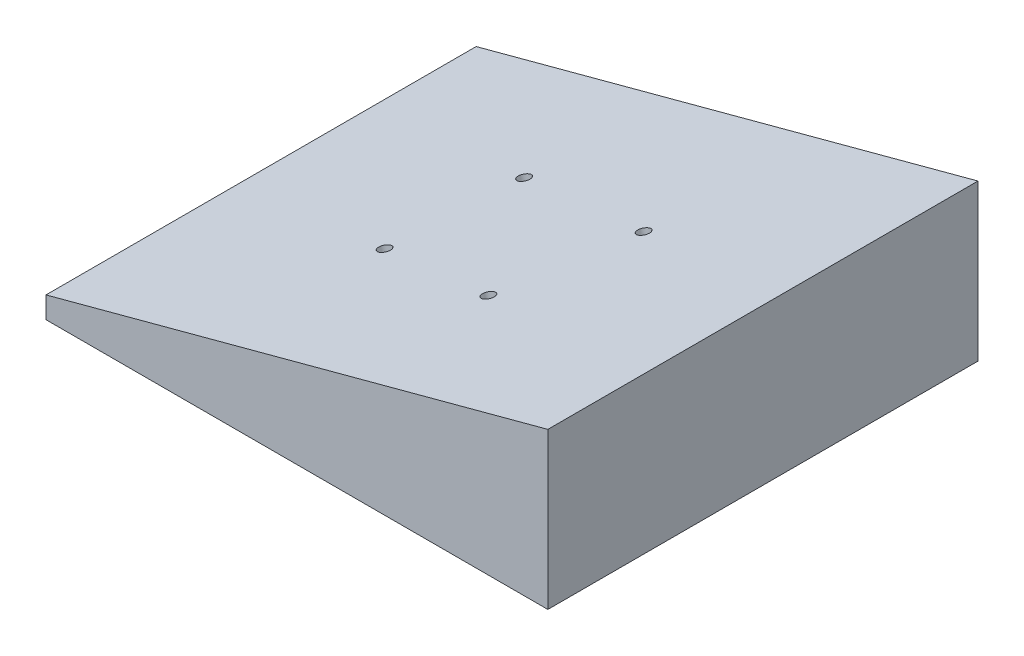
ISO-10303-21;
HEADER;
FILE_DESCRIPTION(('STEP AP214'),'2;1');
FILE_NAME('part.step','',(''),(''),'','','');
FILE_SCHEMA(('AUTOMOTIVE_DESIGN { 1 0 10303 214 1 1 1 1 }'));
ENDSEC;
DATA;
#1=APPLICATION_CONTEXT('core data for automotive mechanical design processes');
#2=APPLICATION_PROTOCOL_DEFINITION('international standard','automotive_design',2000,#1);
#3=PRODUCT_CONTEXT('',#1,'mechanical');
#4=PRODUCT('Part','Part','',(#3));
#5=PRODUCT_RELATED_PRODUCT_CATEGORY('part','',(#4));
#6=PRODUCT_DEFINITION_FORMATION('','',#4);
#7=PRODUCT_DEFINITION_CONTEXT('part definition',#1,'design');
#8=PRODUCT_DEFINITION('design','',#6,#7);
#9=PRODUCT_DEFINITION_SHAPE('','',#8);
#10=(LENGTH_UNIT() NAMED_UNIT(*) SI_UNIT(.MILLI.,.METRE.));
#11=(NAMED_UNIT(*) PLANE_ANGLE_UNIT() SI_UNIT($,.RADIAN.));
#12=(NAMED_UNIT(*) SI_UNIT($,.STERADIAN.) SOLID_ANGLE_UNIT());
#13=UNCERTAINTY_MEASURE_WITH_UNIT(LENGTH_MEASURE(1.E-05),#10,'distance_accuracy_value','');
#14=(GEOMETRIC_REPRESENTATION_CONTEXT(3) GLOBAL_UNCERTAINTY_ASSIGNED_CONTEXT((#13)) GLOBAL_UNIT_ASSIGNED_CONTEXT((#10,
#11,#12)) REPRESENTATION_CONTEXT('',''));
#15=CARTESIAN_POINT('',(0.,0.,0.));
#16=DIRECTION('',(0.,0.,1.));
#17=DIRECTION('',(1.,0.,0.));
#18=AXIS2_PLACEMENT_3D('',#15,#16,#17);
#19=CARTESIAN_POINT('',(0.,3.,60.));
#20=DIRECTION('',(1.,0.,0.));
#21=DIRECTION('',(0.,0.,-1.));
#22=AXIS2_PLACEMENT_3D('',#19,#20,#21);
#23=PLANE('',#22);
#24=DIRECTION('',(0.,-1.,0.));
#25=VECTOR('',#24,1.);
#26=CARTESIAN_POINT('',(0.,3.,0.));
#27=LINE('',#26,#25);
#28=CARTESIAN_POINT('',(0.,3.,0.));
#29=VERTEX_POINT('',#28);
#30=CARTESIAN_POINT('',(0.,0.,0.));
#31=VERTEX_POINT('',#30);
#32=EDGE_CURVE('E107',#29,#31,#27,.T.);
#33=ORIENTED_EDGE('',*,*,#32,.T.);
#34=DIRECTION('',(0.,0.,-1.));
#35=VECTOR('',#34,1.);
#36=CARTESIAN_POINT('',(0.,0.,60.));
#37=LINE('',#36,#35);
#38=CARTESIAN_POINT('',(0.,0.,60.));
#39=VERTEX_POINT('',#38);
#40=EDGE_CURVE('E11',#39,#31,#37,.T.);
#41=ORIENTED_EDGE('',*,*,#40,.F.);
#42=DIRECTION('',(0.,-1.,0.));
#43=VECTOR('',#42,1.);
#44=CARTESIAN_POINT('',(0.,3.,60.));
#45=LINE('',#44,#43);
#46=CARTESIAN_POINT('',(0.,3.,60.));
#47=VERTEX_POINT('',#46);
#48=EDGE_CURVE('E94',#47,#39,#45,.T.);
#49=ORIENTED_EDGE('',*,*,#48,.F.);
#50=DIRECTION('',(0.,0.,-1.));
#51=VECTOR('',#50,1.);
#52=CARTESIAN_POINT('',(0.,3.,60.));
#53=LINE('',#52,#51);
#54=EDGE_CURVE('E103',#47,#29,#53,.T.);
#55=ORIENTED_EDGE('',*,*,#54,.T.);
#56=EDGE_LOOP('',(#33,#41,#49,#55));
#57=FACE_BOUND('',#56,.T.);
#58=ADVANCED_FACE('F41',(#57),#23,.F.);
#59=CARTESIAN_POINT('',(0.,0.,60.));
#60=DIRECTION('',(0.,1.,0.));
#61=DIRECTION('',(0.,0.,1.));
#62=AXIS2_PLACEMENT_3D('',#59,#60,#61);
#63=PLANE('',#62);
#64=CARTESIAN_POINT('',(28.8739804761302,0.,19.503));
#65=DIRECTION('',(0.,1.,0.));
#66=DIRECTION('',(-1.,0.,0.));
#67=AXIS2_PLACEMENT_3D('',#64,#65,#66);
#68=ELLIPSE('',#67,0.879984753348569,0.849999999999999);
#69=CARTESIAN_POINT('',(27.9939957227816,0.,19.503));
#70=VERTEX_POINT('',#69);
#71=EDGE_CURVE('E110',#70,#70,#68,.T.);
#72=ORIENTED_EDGE('',*,*,#71,.T.);
#73=EDGE_LOOP('',(#72));
#74=FACE_BOUND('',#73,.T.);
#75=CARTESIAN_POINT('',(50.6230624741852,0.,23.123));
#76=DIRECTION('',(0.,1.,0.));
#77=DIRECTION('',(-1.,0.,0.));
#78=AXIS2_PLACEMENT_3D('',#75,#76,#77);
#79=ELLIPSE('',#78,0.87998475334857,0.849999999999999);
#80=CARTESIAN_POINT('',(49.7430777208366,0.,23.123));
#81=VERTEX_POINT('',#80);
#82=EDGE_CURVE('E125',#81,#81,#79,.T.);
#83=ORIENTED_EDGE('',*,*,#82,.T.);
#84=EDGE_LOOP('',(#83));
#85=FACE_BOUND('',#84,.T.);
#86=CARTESIAN_POINT('',(46.0398948235098,0.,40.502));
#87=DIRECTION('',(0.,1.,0.));
#88=DIRECTION('',(-1.,0.,0.));
#89=AXIS2_PLACEMENT_3D('',#86,#87,#88);
#90=ELLIPSE('',#89,0.879984753348569,0.849999999999998);
#91=CARTESIAN_POINT('',(45.1599100701612,0.,40.502));
#92=VERTEX_POINT('',#91);
#93=EDGE_CURVE('E122',#92,#92,#90,.T.);
#94=ORIENTED_EDGE('',*,*,#93,.T.);
#95=EDGE_LOOP('',(#94));
#96=FACE_BOUND('',#95,.T.);
#97=CARTESIAN_POINT('',(27.1968330638658,0.,37.391));
#98=DIRECTION('',(0.,1.,0.));
#99=DIRECTION('',(-1.,0.,0.));
#100=AXIS2_PLACEMENT_3D('',#97,#98,#99);
#101=ELLIPSE('',#100,0.87998475334857,0.85);
#102=CARTESIAN_POINT('',(26.3168483105173,0.,37.391));
#103=VERTEX_POINT('',#102);
#104=EDGE_CURVE('E119',#103,#103,#101,.T.);
#105=ORIENTED_EDGE('',*,*,#104,.T.);
#106=EDGE_LOOP('',(#105));
#107=FACE_BOUND('',#106,.T.);
#108=DIRECTION('',(1.,0.,0.));
#109=VECTOR('',#108,1.);
#110=CARTESIAN_POINT('',(0.,0.,0.));
#111=LINE('',#110,#109);
#112=CARTESIAN_POINT('',(70.,0.,0.));
#113=VERTEX_POINT('',#112);
#114=EDGE_CURVE('E98',#31,#113,#111,.T.);
#115=ORIENTED_EDGE('',*,*,#114,.T.);
#116=DIRECTION('',(0.,0.,-1.));
#117=VECTOR('',#116,1.);
#118=CARTESIAN_POINT('',(70.,0.,60.));
#119=LINE('',#118,#117);
#120=CARTESIAN_POINT('',(70.,0.,60.));
#121=VERTEX_POINT('',#120);
#122=EDGE_CURVE('E50',#121,#113,#119,.T.);
#123=ORIENTED_EDGE('',*,*,#122,.F.);
#124=DIRECTION('',(1.,0.,0.));
#125=VECTOR('',#124,1.);
#126=CARTESIAN_POINT('',(0.,0.,60.));
#127=LINE('',#126,#125);
#128=EDGE_CURVE('E89',#39,#121,#127,.T.);
#129=ORIENTED_EDGE('',*,*,#128,.F.);
#130=ORIENTED_EDGE('',*,*,#40,.T.);
#131=EDGE_LOOP('',(#115,#123,#129,#130));
#132=FACE_BOUND('',#131,.T.);
#133=ADVANCED_FACE('F97',(#74,#85,#96,#107,#132),#63,.F.);
#134=CARTESIAN_POINT('',(70.,0.,60.));
#135=DIRECTION('',(-1.,0.,0.));
#136=DIRECTION('',(0.,0.,1.));
#137=AXIS2_PLACEMENT_3D('',#134,#135,#136);
#138=PLANE('',#137);
#139=DIRECTION('',(0.,1.,0.));
#140=VECTOR('',#139,1.);
#141=CARTESIAN_POINT('',(70.,0.,0.));
#142=LINE('',#141,#140);
#143=CARTESIAN_POINT('',(70.,21.7564434701786,0.));
#144=VERTEX_POINT('',#143);
#145=EDGE_CURVE('E76',#113,#144,#142,.T.);
#146=ORIENTED_EDGE('',*,*,#145,.T.);
#147=DIRECTION('',(0.,0.,-1.));
#148=VECTOR('',#147,1.);
#149=CARTESIAN_POINT('',(70.,21.7564434701786,60.));
#150=LINE('',#149,#148);
#151=CARTESIAN_POINT('',(70.,21.7564434701786,60.));
#152=VERTEX_POINT('',#151);
#153=EDGE_CURVE('E99',#152,#144,#150,.T.);
#154=ORIENTED_EDGE('',*,*,#153,.F.);
#155=DIRECTION('',(0.,1.,0.));
#156=VECTOR('',#155,1.);
#157=CARTESIAN_POINT('',(70.,0.,60.));
#158=LINE('',#157,#156);
#159=EDGE_CURVE('E92',#121,#152,#158,.T.);
#160=ORIENTED_EDGE('',*,*,#159,.F.);
#161=ORIENTED_EDGE('',*,*,#122,.T.);
#162=EDGE_LOOP('',(#146,#154,#160,#161));
#163=FACE_BOUND('',#162,.T.);
#164=ADVANCED_FACE('F101',(#163),#138,.F.);
#165=CARTESIAN_POINT('',(70.,21.7564434701786,60.));
#166=DIRECTION('',(0.258819045102521,-0.965925826289068,0.));
#167=DIRECTION('',(0.965925826289068,0.258819045102521,0.));
#168=AXIS2_PLACEMENT_3D('',#165,#166,#167);
#169=PLANE('',#168);
#170=CARTESIAN_POINT('',(26.1897905384174,10.0175332247092,19.503));
#171=DIRECTION('',(0.258819045102521,-0.965925826289068,0.));
#172=DIRECTION('',(0.965925826289068,0.258819045102521,0.));
#173=AXIS2_PLACEMENT_3D('',#170,#171,#172);
#174=CIRCLE('',#173,0.849999999999999);
#175=CARTESIAN_POINT('',(27.0108274907631,10.2375294130463,19.503));
#176=VERTEX_POINT('',#175);
#177=EDGE_CURVE('E44',#176,#176,#174,.T.);
#178=ORIENTED_EDGE('',*,*,#177,.T.);
#179=EDGE_LOOP('',(#178));
#180=FACE_BOUND('',#179,.T.);
#181=CARTESIAN_POINT('',(46.4819602970982,15.454803724223,23.123));
#182=DIRECTION('',(0.258819045102521,-0.965925826289068,0.));
#183=DIRECTION('',(0.965925826289068,0.258819045102521,0.));
#184=AXIS2_PLACEMENT_3D('',#181,#182,#183);
#185=CIRCLE('',#184,0.849999999999999);
#186=CARTESIAN_POINT('',(47.3029972494439,15.6747999125601,23.123));
#187=VERTEX_POINT('',#186);
#188=EDGE_CURVE('E123',#187,#187,#185,.T.);
#189=ORIENTED_EDGE('',*,*,#188,.T.);
#190=EDGE_LOOP('',(#189));
#191=FACE_BOUND('',#190,.T.);
#192=CARTESIAN_POINT('',(42.2058066641165,14.3090118115541,40.502));
#193=DIRECTION('',(0.258819045102521,-0.965925826289068,0.));
#194=DIRECTION('',(0.965925826289068,0.258819045102521,0.));
#195=AXIS2_PLACEMENT_3D('',#192,#193,#194);
#196=CIRCLE('',#195,0.849999999999998);
#197=CARTESIAN_POINT('',(43.0268436164622,14.5290079998912,40.502));
#198=VERTEX_POINT('',#197);
#199=EDGE_CURVE('E120',#198,#198,#196,.T.);
#200=ORIENTED_EDGE('',*,*,#199,.T.);
#201=EDGE_LOOP('',(#200));
#202=FACE_BOUND('',#201,.T.);
#203=CARTESIAN_POINT('',(24.6249906998291,9.59824637164311,37.391));
#204=DIRECTION('',(0.258819045102521,-0.965925826289068,0.));
#205=DIRECTION('',(0.965925826289068,0.258819045102521,0.));
#206=AXIS2_PLACEMENT_3D('',#203,#204,#205);
#207=CIRCLE('',#206,0.85);
#208=CARTESIAN_POINT('',(25.4460276521748,9.81824255998026,37.391));
#209=VERTEX_POINT('',#208);
#210=EDGE_CURVE('E116',#209,#209,#207,.T.);
#211=ORIENTED_EDGE('',*,*,#210,.T.);
#212=EDGE_LOOP('',(#211));
#213=FACE_BOUND('',#212,.T.);
#214=DIRECTION('',(-0.965925826289068,-0.258819045102521,0.));
#215=VECTOR('',#214,1.);
#216=CARTESIAN_POINT('',(70.,21.7564434701786,0.));
#217=LINE('',#216,#215);
#218=EDGE_CURVE('E82',#144,#29,#217,.T.);
#219=ORIENTED_EDGE('',*,*,#218,.T.);
#220=ORIENTED_EDGE('',*,*,#54,.F.);
#221=DIRECTION('',(-0.965925826289068,-0.258819045102521,0.));
#222=VECTOR('',#221,1.);
#223=CARTESIAN_POINT('',(70.,21.7564434701786,60.));
#224=LINE('',#223,#222);
#225=EDGE_CURVE('E59',#152,#47,#224,.T.);
#226=ORIENTED_EDGE('',*,*,#225,.F.);
#227=ORIENTED_EDGE('',*,*,#153,.T.);
#228=EDGE_LOOP('',(#219,#220,#226,#227));
#229=FACE_BOUND('',#228,.T.);
#230=ADVANCED_FACE('F142',(#180,#191,#202,#213,#229),#169,.F.);
#231=CARTESIAN_POINT('',(0.,0.,60.));
#232=DIRECTION('',(0.,0.,1.));
#233=DIRECTION('',(1.,0.,0.));
#234=AXIS2_PLACEMENT_3D('',#231,#232,#233);
#235=PLANE('',#234);
#236=ORIENTED_EDGE('',*,*,#48,.T.);
#237=ORIENTED_EDGE('',*,*,#128,.T.);
#238=ORIENTED_EDGE('',*,*,#159,.T.);
#239=ORIENTED_EDGE('',*,*,#225,.T.);
#240=EDGE_LOOP('',(#236,#237,#238,#239));
#241=FACE_BOUND('',#240,.T.);
#242=ADVANCED_FACE('F90',(#241),#235,.T.);
#243=CARTESIAN_POINT('',(0.,0.,0.));
#244=DIRECTION('',(0.,0.,1.));
#245=DIRECTION('',(1.,0.,0.));
#246=AXIS2_PLACEMENT_3D('',#243,#244,#245);
#247=PLANE('',#246);
#248=ORIENTED_EDGE('',*,*,#32,.F.);
#249=ORIENTED_EDGE('',*,*,#218,.F.);
#250=ORIENTED_EDGE('',*,*,#145,.F.);
#251=ORIENTED_EDGE('',*,*,#114,.F.);
#252=EDGE_LOOP('',(#248,#249,#250,#251));
#253=FACE_BOUND('',#252,.T.);
#254=ADVANCED_FACE('F162',(#253),#247,.F.);
#255=CARTESIAN_POINT('',(32.3895620529047,-19.3795284170289,37.391));
#256=DIRECTION('',(-0.258819045102521,0.965925826289068,0.));
#257=DIRECTION('',(-0.965925826289068,-0.258819045102521,0.));
#258=AXIS2_PLACEMENT_3D('',#255,#256,#257);
#259=CYLINDRICAL_SURFACE('',#258,0.85);
#260=ORIENTED_EDGE('',*,*,#210,.F.);
#261=EDGE_LOOP('',(#260));
#262=FACE_BOUND('',#261,.T.);
#263=ORIENTED_EDGE('',*,*,#104,.F.);
#264=EDGE_LOOP('',(#263));
#265=FACE_BOUND('',#264,.T.);
#266=ADVANCED_FACE('F164',(#262,#265),#259,.F.);
#267=CARTESIAN_POINT('',(49.9703780171921,-14.6687629771179,40.502));
#268=DIRECTION('',(-0.258819045102521,0.965925826289068,0.));
#269=DIRECTION('',(-0.965925826289068,-0.258819045102521,0.));
#270=AXIS2_PLACEMENT_3D('',#267,#268,#269);
#271=CYLINDRICAL_SURFACE('',#270,0.849999999999998);
#272=ORIENTED_EDGE('',*,*,#199,.F.);
#273=EDGE_LOOP('',(#272));
#274=FACE_BOUND('',#273,.T.);
#275=ORIENTED_EDGE('',*,*,#93,.F.);
#276=EDGE_LOOP('',(#275));
#277=FACE_BOUND('',#276,.T.);
#278=ADVANCED_FACE('F152',(#274,#277),#271,.F.);
#279=CARTESIAN_POINT('',(54.2465316501738,-13.5229710644491,23.123));
#280=DIRECTION('',(-0.258819045102521,0.965925826289068,0.));
#281=DIRECTION('',(-0.965925826289068,-0.258819045102521,0.));
#282=AXIS2_PLACEMENT_3D('',#279,#280,#281);
#283=CYLINDRICAL_SURFACE('',#282,0.849999999999999);
#284=ORIENTED_EDGE('',*,*,#188,.F.);
#285=EDGE_LOOP('',(#284));
#286=FACE_BOUND('',#285,.T.);
#287=ORIENTED_EDGE('',*,*,#82,.F.);
#288=EDGE_LOOP('',(#287));
#289=FACE_BOUND('',#288,.T.);
#290=ADVANCED_FACE('F147',(#286,#289),#283,.F.);
#291=CARTESIAN_POINT('',(33.954361891493,-18.9602415639628,19.503));
#292=DIRECTION('',(-0.258819045102521,0.965925826289068,0.));
#293=DIRECTION('',(-0.965925826289068,-0.258819045102521,0.));
#294=AXIS2_PLACEMENT_3D('',#291,#292,#293);
#295=CYLINDRICAL_SURFACE('',#294,0.849999999999999);
#296=ORIENTED_EDGE('',*,*,#177,.F.);
#297=EDGE_LOOP('',(#296));
#298=FACE_BOUND('',#297,.T.);
#299=ORIENTED_EDGE('',*,*,#71,.F.);
#300=EDGE_LOOP('',(#299));
#301=FACE_BOUND('',#300,.T.);
#302=ADVANCED_FACE('F144',(#298,#301),#295,.F.);
#303=CLOSED_SHELL('',(#58,#133,#164,#230,#242,#254,#266,#278,#290,#302));
#304=MANIFOLD_SOLID_BREP('B2',#303);
#305=ADVANCED_BREP_SHAPE_REPRESENTATION('',(#18,#304),#14);
#306=SHAPE_DEFINITION_REPRESENTATION(#9,#305);
ENDSEC;
END-ISO-10303-21;
